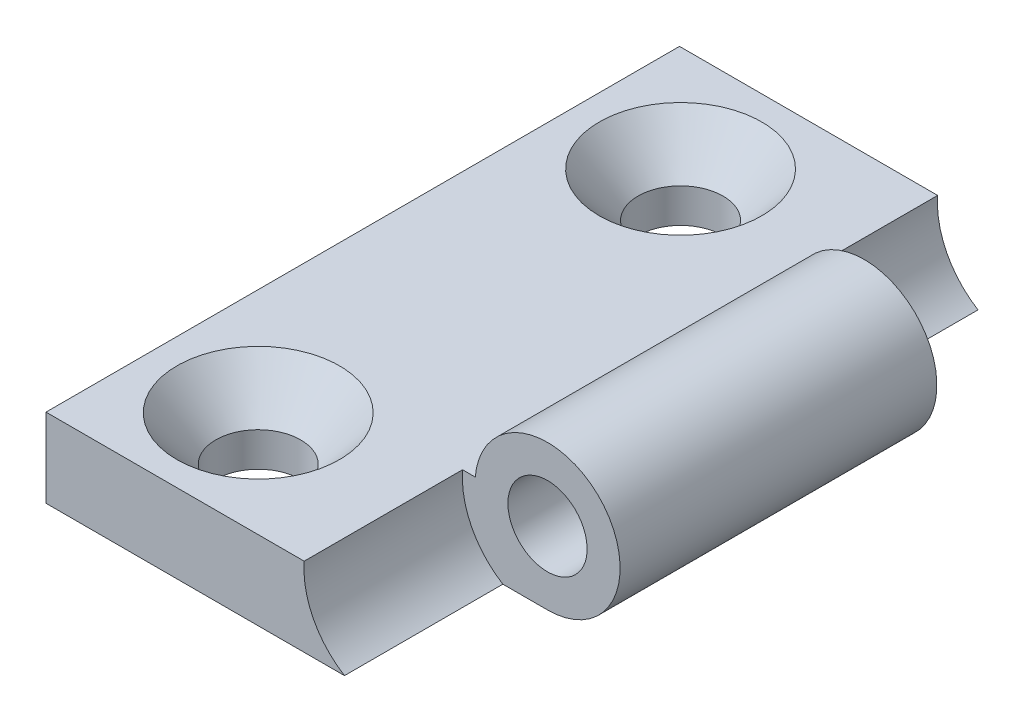
ISO-10303-21;
HEADER;
FILE_DESCRIPTION(('STEP AP214'),'2;1');
FILE_NAME('part.step','',(''),(''),'','','');
FILE_SCHEMA(('AUTOMOTIVE_DESIGN { 1 0 10303 214 1 1 1 1 }'));
ENDSEC;
DATA;
#1=APPLICATION_CONTEXT('core data for automotive mechanical design processes');
#2=APPLICATION_PROTOCOL_DEFINITION('international standard','automotive_design',2000,#1);
#3=PRODUCT_CONTEXT('',#1,'mechanical');
#4=PRODUCT('Part','Part','',(#3));
#5=PRODUCT_RELATED_PRODUCT_CATEGORY('part','',(#4));
#6=PRODUCT_DEFINITION_FORMATION('','',#4);
#7=PRODUCT_DEFINITION_CONTEXT('part definition',#1,'design');
#8=PRODUCT_DEFINITION('design','',#6,#7);
#9=PRODUCT_DEFINITION_SHAPE('','',#8);
#10=(LENGTH_UNIT() NAMED_UNIT(*) SI_UNIT(.MILLI.,.METRE.));
#11=(NAMED_UNIT(*) PLANE_ANGLE_UNIT() SI_UNIT($,.RADIAN.));
#12=(NAMED_UNIT(*) SI_UNIT($,.STERADIAN.) SOLID_ANGLE_UNIT());
#13=UNCERTAINTY_MEASURE_WITH_UNIT(LENGTH_MEASURE(1.E-05),#10,'distance_accuracy_value','');
#14=(GEOMETRIC_REPRESENTATION_CONTEXT(3) GLOBAL_UNCERTAINTY_ASSIGNED_CONTEXT((#13)) GLOBAL_UNIT_ASSIGNED_CONTEXT((#10,
#11,#12)) REPRESENTATION_CONTEXT('',''));
#15=CARTESIAN_POINT('',(0.,0.,0.));
#16=DIRECTION('',(0.,0.,1.));
#17=DIRECTION('',(1.,0.,0.));
#18=AXIS2_PLACEMENT_3D('',#15,#16,#17);
#19=CARTESIAN_POINT('',(0.,4.365625,19.05));
#20=DIRECTION('',(0.,0.,-1.));
#21=DIRECTION('',(-1.,0.,0.));
#22=AXIS2_PLACEMENT_3D('',#19,#20,#21);
#23=CYLINDRICAL_SURFACE('',#22,4.365625);
#24=CARTESIAN_POINT('',(0.,4.365625,-9.525));
#25=DIRECTION('',(0.,0.,-1.));
#26=DIRECTION('',(-1.,0.,0.));
#27=AXIS2_PLACEMENT_3D('',#24,#25,#26);
#28=CIRCLE('',#27,4.365625);
#29=CARTESIAN_POINT('',(-4.34868844710678,4.7498,-9.525));
#30=VERTEX_POINT('',#29);
#31=CARTESIAN_POINT('',(0.,0.,-9.525));
#32=VERTEX_POINT('',#31);
#33=EDGE_CURVE('E102',#30,#32,#28,.T.);
#34=ORIENTED_EDGE('',*,*,#33,.F.);
#35=DIRECTION('',(0.,0.,-1.));
#36=VECTOR('',#35,1.);
#37=CARTESIAN_POINT('',(-4.34868844710678,4.7498,19.05));
#38=LINE('',#37,#36);
#39=CARTESIAN_POINT('',(-4.34868844710678,4.7498,9.525));
#40=VERTEX_POINT('',#39);
#41=EDGE_CURVE('E112',#40,#30,#38,.T.);
#42=ORIENTED_EDGE('',*,*,#41,.F.);
#43=CARTESIAN_POINT('',(0.,4.365625,9.525));
#44=DIRECTION('',(0.,0.,1.));
#45=DIRECTION('',(1.,0.,0.));
#46=AXIS2_PLACEMENT_3D('',#43,#44,#45);
#47=CIRCLE('',#46,4.365625);
#48=CARTESIAN_POINT('',(0.,0.,9.525));
#49=VERTEX_POINT('',#48);
#50=EDGE_CURVE('E58',#49,#40,#47,.T.);
#51=ORIENTED_EDGE('',*,*,#50,.F.);
#52=DIRECTION('',(0.,0.,-1.));
#53=VECTOR('',#52,1.);
#54=CARTESIAN_POINT('',(0.,0.,19.05));
#55=LINE('',#54,#53);
#56=EDGE_CURVE('E43',#49,#32,#55,.T.);
#57=ORIENTED_EDGE('',*,*,#56,.T.);
#58=EDGE_LOOP('',(#34,#42,#51,#57));
#59=FACE_BOUND('',#58,.T.);
#60=ADVANCED_FACE('F34',(#59),#23,.T.);
#61=CARTESIAN_POINT('',(0.,4.365625,19.05));
#62=DIRECTION('',(0.,0.,-1.));
#63=DIRECTION('',(-1.,0.,0.));
#64=AXIS2_PLACEMENT_3D('',#61,#62,#63);
#65=CYLINDRICAL_SURFACE('',#64,2.38125);
#66=CARTESIAN_POINT('',(0.,4.365625,9.525));
#67=DIRECTION('',(0.,0.,1.));
#68=DIRECTION('',(1.,0.,0.));
#69=AXIS2_PLACEMENT_3D('',#66,#67,#68);
#70=CIRCLE('',#69,2.38125);
#71=CARTESIAN_POINT('',(-2.38125,4.365625,9.525));
#72=VERTEX_POINT('',#71);
#73=EDGE_CURVE('E38',#72,#72,#70,.T.);
#74=CARTESIAN_POINT('',(0.,4.365625,-9.525));
#75=DIRECTION('',(0.,0.,-1.));
#76=DIRECTION('',(-1.,0.,0.));
#77=AXIS2_PLACEMENT_3D('',#74,#75,#76);
#78=CIRCLE('',#77,2.38125);
#79=CARTESIAN_POINT('',(-2.38125,4.365625,-9.525));
#80=VERTEX_POINT('',#79);
#81=EDGE_CURVE('E115',#80,#80,#78,.T.);
#82=CARTESIAN_POINT('',(-2.38125,4.365625,9.525));
#83=CARTESIAN_POINT('',(-2.38125,4.365625,9.3265625));
#84=CARTESIAN_POINT('',(-2.38125,4.365625,9.128125));
#85=CARTESIAN_POINT('',(-2.38125,4.365625,8.73125));
#86=CARTESIAN_POINT('',(-2.38125,4.365625,8.5328125));
#87=CARTESIAN_POINT('',(-2.38125,4.365625,8.1359375));
#88=CARTESIAN_POINT('',(-2.38125,4.365625,7.9375));
#89=CARTESIAN_POINT('',(-2.38125,4.365625,7.540625));
#90=CARTESIAN_POINT('',(-2.38125,4.365625,7.3421875));
#91=CARTESIAN_POINT('',(-2.38125,4.365625,6.9453125));
#92=CARTESIAN_POINT('',(-2.38125,4.365625,6.746875));
#93=CARTESIAN_POINT('',(-2.38125,4.365625,6.35));
#94=CARTESIAN_POINT('',(-2.38125,4.365625,6.1515625));
#95=CARTESIAN_POINT('',(-2.38125,4.365625,5.7546875));
#96=CARTESIAN_POINT('',(-2.38125,4.365625,5.55625));
#97=CARTESIAN_POINT('',(-2.38125,4.365625,5.159375));
#98=CARTESIAN_POINT('',(-2.38125,4.365625,4.9609375));
#99=CARTESIAN_POINT('',(-2.38125,4.365625,4.5640625));
#100=CARTESIAN_POINT('',(-2.38125,4.365625,4.365625));
#101=CARTESIAN_POINT('',(-2.38125,4.365625,3.96875));
#102=CARTESIAN_POINT('',(-2.38125,4.365625,3.7703125));
#103=CARTESIAN_POINT('',(-2.38125,4.365625,3.3734375));
#104=CARTESIAN_POINT('',(-2.38125,4.365625,3.175));
#105=CARTESIAN_POINT('',(-2.38125,4.365625,2.778125));
#106=CARTESIAN_POINT('',(-2.38125,4.365625,2.5796875));
#107=CARTESIAN_POINT('',(-2.38125,4.365625,2.1828125));
#108=CARTESIAN_POINT('',(-2.38125,4.365625,1.984375));
#109=CARTESIAN_POINT('',(-2.38125,4.365625,1.5875));
#110=CARTESIAN_POINT('',(-2.38125,4.365625,1.3890625));
#111=CARTESIAN_POINT('',(-2.38125,4.365625,0.992187500000001));
#112=CARTESIAN_POINT('',(-2.38125,4.365625,0.793750000000001));
#113=CARTESIAN_POINT('',(-2.38125,4.365625,0.396875));
#114=CARTESIAN_POINT('',(-2.38125,4.365625,0.1984375));
#115=CARTESIAN_POINT('',(-2.38125,4.365625,-0.1984375));
#116=CARTESIAN_POINT('',(-2.38125,4.365625,-0.396875));
#117=CARTESIAN_POINT('',(-2.38125,4.365625,-0.793750000000001));
#118=CARTESIAN_POINT('',(-2.38125,4.365625,-0.992187500000001));
#119=CARTESIAN_POINT('',(-2.38125,4.365625,-1.3890625));
#120=CARTESIAN_POINT('',(-2.38125,4.365625,-1.5875));
#121=CARTESIAN_POINT('',(-2.38125,4.365625,-1.984375));
#122=CARTESIAN_POINT('',(-2.38125,4.365625,-2.1828125));
#123=CARTESIAN_POINT('',(-2.38125,4.365625,-2.5796875));
#124=CARTESIAN_POINT('',(-2.38125,4.365625,-2.778125));
#125=CARTESIAN_POINT('',(-2.38125,4.365625,-3.175));
#126=CARTESIAN_POINT('',(-2.38125,4.365625,-3.3734375));
#127=CARTESIAN_POINT('',(-2.38125,4.365625,-3.7703125));
#128=CARTESIAN_POINT('',(-2.38125,4.365625,-3.96875));
#129=CARTESIAN_POINT('',(-2.38125,4.365625,-4.365625));
#130=CARTESIAN_POINT('',(-2.38125,4.365625,-4.5640625));
#131=CARTESIAN_POINT('',(-2.38125,4.365625,-4.9609375));
#132=CARTESIAN_POINT('',(-2.38125,4.365625,-5.159375));
#133=CARTESIAN_POINT('',(-2.38125,4.365625,-5.55625));
#134=CARTESIAN_POINT('',(-2.38125,4.365625,-5.7546875));
#135=CARTESIAN_POINT('',(-2.38125,4.365625,-6.1515625));
#136=CARTESIAN_POINT('',(-2.38125,4.365625,-6.35));
#137=CARTESIAN_POINT('',(-2.38125,4.365625,-6.746875));
#138=CARTESIAN_POINT('',(-2.38125,4.365625,-6.9453125));
#139=CARTESIAN_POINT('',(-2.38125,4.365625,-7.3421875));
#140=CARTESIAN_POINT('',(-2.38125,4.365625,-7.540625));
#141=CARTESIAN_POINT('',(-2.38125,4.365625,-7.9375));
#142=CARTESIAN_POINT('',(-2.38125,4.365625,-8.1359375));
#143=CARTESIAN_POINT('',(-2.38125,4.365625,-8.5328125));
#144=CARTESIAN_POINT('',(-2.38125,4.365625,-8.73125));
#145=CARTESIAN_POINT('',(-2.38125,4.365625,-9.128125));
#146=CARTESIAN_POINT('',(-2.38125,4.365625,-9.3265625));
#147=CARTESIAN_POINT('',(-2.38125,4.365625,-9.525));
#148=B_SPLINE_CURVE_WITH_KNOTS('',3,(#82,#83,#84,#85,#86,#87,#88,#89,#90,#91,#92,#93,#94,#95,
#96,#97,#98,#99,#100,#101,#102,#103,#104,#105,#106,#107,#108,#109,#110,#111,#112,#113,#114,#115,
#116,#117,#118,#119,#120,#121,#122,#123,#124,#125,#126,#127,#128,#129,#130,#131,#132,#133,#134,
#135,#136,#137,#138,#139,#140,#141,#142,#143,#144,#145,#146,#147),.UNSPECIFIED.,.F.,.F.,(4,2,2,
2,2,2,2,2,2,2,2,2,2,2,2,2,2,2,2,2,2,2,2,2,2,2,2,2,2,2,2,2,4),(0.,0.5953125,1.190625,1.7859375,
2.38125,2.9765625,3.571875,4.1671875,4.7625,5.3578125,5.953125,6.5484375,7.14375,7.7390625,
8.334375,8.9296875,9.525,10.1203125,10.715625,11.3109375,11.90625,12.5015625,13.096875,
13.6921875,14.2875,14.8828125,15.478125,16.0734375,16.66875,17.2640625,17.859375,18.4546875,
19.05),.UNSPECIFIED.);
#149=EDGE_CURVE('BSEAM223',#72,#80,#148,.T.);
#150=ORIENTED_EDGE('',*,*,#73,.T.);
#151=ORIENTED_EDGE('',*,*,#81,.T.);
#152=ORIENTED_EDGE('',*,*,#149,.T.);
#153=ORIENTED_EDGE('',*,*,#149,.F.);
#154=EDGE_LOOP('',(#150,#152,#151,#153));
#155=FACE_BOUND('',#154,.T.);
#156=ADVANCED_FACE('F223',(#155),#65,.F.);
#157=CARTESIAN_POINT('',(0.,4.365625,-19.05));
#158=DIRECTION('',(0.,0.,1.));
#159=DIRECTION('',(1.,0.,0.));
#160=AXIS2_PLACEMENT_3D('',#157,#158,#159);
#161=PLANE('',#160);
#162=CARTESIAN_POINT('',(0.,4.365625,-19.05));
#163=DIRECTION('',(0.,0.,1.));
#164=DIRECTION('',(1.,0.,0.));
#165=AXIS2_PLACEMENT_3D('',#162,#163,#164);
#166=CIRCLE('',#165,5.1251074948742);
#167=CARTESIAN_POINT('',(-5.11068844710678,4.7498,-19.05));
#168=VERTEX_POINT('',#167);
#169=CARTESIAN_POINT('',(-2.68478028773133,0.,-19.05));
#170=VERTEX_POINT('',#169);
#171=EDGE_CURVE('E161',#168,#170,#166,.T.);
#172=ORIENTED_EDGE('',*,*,#171,.T.);
#173=DIRECTION('',(1.,0.,0.));
#174=VECTOR('',#173,1.);
#175=CARTESIAN_POINT('',(-20.6375,0.,-19.05));
#176=LINE('',#175,#174);
#177=CARTESIAN_POINT('',(-20.6375,0.,-19.05));
#178=VERTEX_POINT('',#177);
#179=EDGE_CURVE('E130',#178,#170,#176,.T.);
#180=ORIENTED_EDGE('',*,*,#179,.F.);
#181=DIRECTION('',(0.,-1.,0.));
#182=VECTOR('',#181,1.);
#183=CARTESIAN_POINT('',(-20.6375,0.,-19.05));
#184=LINE('',#183,#182);
#185=CARTESIAN_POINT('',(-20.6375,4.7498,-19.05));
#186=VERTEX_POINT('',#185);
#187=EDGE_CURVE('E133',#186,#178,#184,.T.);
#188=ORIENTED_EDGE('',*,*,#187,.F.);
#189=DIRECTION('',(-1.,0.,0.));
#190=VECTOR('',#189,1.);
#191=CARTESIAN_POINT('',(-20.6375,4.7498,-19.05));
#192=LINE('',#191,#190);
#193=EDGE_CURVE('E127',#168,#186,#192,.T.);
#194=ORIENTED_EDGE('',*,*,#193,.F.);
#195=EDGE_LOOP('',(#172,#180,#188,#194));
#196=FACE_BOUND('',#195,.T.);
#197=ADVANCED_FACE('F228',(#196),#161,.F.);
#198=CARTESIAN_POINT('',(-20.6375,0.,19.05));
#199=DIRECTION('',(0.,1.,0.));
#200=DIRECTION('',(0.,0.,1.));
#201=AXIS2_PLACEMENT_3D('',#198,#199,#200);
#202=PLANE('',#201);
#203=CARTESIAN_POINT('',(-14.224,0.,-12.7));
#204=DIRECTION('',(0.,1.,0.));
#205=DIRECTION('',(0.,0.,1.));
#206=AXIS2_PLACEMENT_3D('',#203,#204,#205);
#207=CIRCLE('',#206,2.5527);
#208=CARTESIAN_POINT('',(-14.224,0.,-10.1473));
#209=VERTEX_POINT('',#208);
#210=EDGE_CURVE('E181',#209,#209,#207,.T.);
#211=ORIENTED_EDGE('',*,*,#210,.T.);
#212=EDGE_LOOP('',(#211));
#213=FACE_BOUND('',#212,.T.);
#214=CARTESIAN_POINT('',(-14.224,0.,12.7));
#215=DIRECTION('',(0.,1.,0.));
#216=DIRECTION('',(0.,0.,1.));
#217=AXIS2_PLACEMENT_3D('',#214,#215,#216);
#218=CIRCLE('',#217,2.5527);
#219=CARTESIAN_POINT('',(-14.224,0.,15.2527));
#220=VERTEX_POINT('',#219);
#221=EDGE_CURVE('E172',#220,#220,#218,.T.);
#222=ORIENTED_EDGE('',*,*,#221,.T.);
#223=EDGE_LOOP('',(#222));
#224=FACE_BOUND('',#223,.T.);
#225=DIRECTION('',(0.,0.,-1.));
#226=VECTOR('',#225,1.);
#227=CARTESIAN_POINT('',(-2.68478028773133,0.,-9.525));
#228=LINE('',#227,#226);
#229=CARTESIAN_POINT('',(-2.68478028773133,0.,-9.525));
#230=VERTEX_POINT('',#229);
#231=EDGE_CURVE('E157',#230,#170,#228,.T.);
#232=ORIENTED_EDGE('',*,*,#231,.F.);
#233=DIRECTION('',(1.,0.,0.));
#234=VECTOR('',#233,1.);
#235=CARTESIAN_POINT('',(0.,0.,-9.525));
#236=LINE('',#235,#234);
#237=EDGE_CURVE('E107',#230,#32,#236,.T.);
#238=ORIENTED_EDGE('',*,*,#237,.T.);
#239=ORIENTED_EDGE('',*,*,#56,.F.);
#240=DIRECTION('',(1.,0.,0.));
#241=VECTOR('',#240,1.);
#242=CARTESIAN_POINT('',(0.,0.,9.525));
#243=LINE('',#242,#241);
#244=CARTESIAN_POINT('',(-2.68478028773133,0.,9.525));
#245=VERTEX_POINT('',#244);
#246=EDGE_CURVE('E151',#245,#49,#243,.T.);
#247=ORIENTED_EDGE('',*,*,#246,.F.);
#248=DIRECTION('',(0.,0.,1.));
#249=VECTOR('',#248,1.);
#250=CARTESIAN_POINT('',(-2.68478028773133,0.,9.525));
#251=LINE('',#250,#249);
#252=CARTESIAN_POINT('',(-2.68478028773133,0.,19.05));
#253=VERTEX_POINT('',#252);
#254=EDGE_CURVE('E143',#245,#253,#251,.T.);
#255=ORIENTED_EDGE('',*,*,#254,.T.);
#256=DIRECTION('',(1.,0.,0.));
#257=VECTOR('',#256,1.);
#258=CARTESIAN_POINT('',(-20.6375,0.,19.05));
#259=LINE('',#258,#257);
#260=CARTESIAN_POINT('',(-20.6375,0.,19.05));
#261=VERTEX_POINT('',#260);
#262=EDGE_CURVE('E137',#261,#253,#259,.T.);
#263=ORIENTED_EDGE('',*,*,#262,.F.);
#264=DIRECTION('',(0.,0.,-1.));
#265=VECTOR('',#264,1.);
#266=CARTESIAN_POINT('',(-20.6375,0.,19.05));
#267=LINE('',#266,#265);
#268=EDGE_CURVE('E11',#261,#178,#267,.T.);
#269=ORIENTED_EDGE('',*,*,#268,.T.);
#270=ORIENTED_EDGE('',*,*,#179,.T.);
#271=EDGE_LOOP('',(#232,#238,#239,#247,#255,#263,#269,#270));
#272=FACE_BOUND('',#271,.T.);
#273=ADVANCED_FACE('F185',(#213,#224,#272),#202,.F.);
#274=CARTESIAN_POINT('',(-20.6375,4.7498,19.05));
#275=DIRECTION('',(0.,-1.,0.));
#276=DIRECTION('',(0.,0.,-1.));
#277=AXIS2_PLACEMENT_3D('',#274,#275,#276);
#278=PLANE('',#277);
#279=CARTESIAN_POINT('',(-14.224,4.7498,-12.7));
#280=DIRECTION('',(0.,1.,0.));
#281=DIRECTION('',(0.,0.,1.));
#282=AXIS2_PLACEMENT_3D('',#279,#280,#281);
#283=CIRCLE('',#282,4.8895);
#284=CARTESIAN_POINT('',(-14.224,4.7498,-7.81049999999999));
#285=VERTEX_POINT('',#284);
#286=EDGE_CURVE('E175',#285,#285,#283,.T.);
#287=ORIENTED_EDGE('',*,*,#286,.F.);
#288=EDGE_LOOP('',(#287));
#289=FACE_BOUND('',#288,.T.);
#290=CARTESIAN_POINT('',(-14.224,4.7498,12.7));
#291=DIRECTION('',(0.,1.,0.));
#292=DIRECTION('',(0.,0.,1.));
#293=AXIS2_PLACEMENT_3D('',#290,#291,#292);
#294=CIRCLE('',#293,4.8895);
#295=CARTESIAN_POINT('',(-14.224,4.7498,17.5895));
#296=VERTEX_POINT('',#295);
#297=EDGE_CURVE('E164',#296,#296,#294,.T.);
#298=ORIENTED_EDGE('',*,*,#297,.F.);
#299=EDGE_LOOP('',(#298));
#300=FACE_BOUND('',#299,.T.);
#301=DIRECTION('',(0.,0.,-1.));
#302=VECTOR('',#301,1.);
#303=CARTESIAN_POINT('',(-5.11068844710678,4.7498,-9.525));
#304=LINE('',#303,#302);
#305=CARTESIAN_POINT('',(-5.11068844710678,4.7498,-9.525));
#306=VERTEX_POINT('',#305);
#307=EDGE_CURVE('E158',#306,#168,#304,.T.);
#308=ORIENTED_EDGE('',*,*,#307,.T.);
#309=ORIENTED_EDGE('',*,*,#193,.T.);
#310=DIRECTION('',(0.,0.,-1.));
#311=VECTOR('',#310,1.);
#312=CARTESIAN_POINT('',(-20.6375,4.7498,19.05));
#313=LINE('',#312,#311);
#314=CARTESIAN_POINT('',(-20.6375,4.7498,19.05));
#315=VERTEX_POINT('',#314);
#316=EDGE_CURVE('E120',#315,#186,#313,.T.);
#317=ORIENTED_EDGE('',*,*,#316,.F.);
#318=DIRECTION('',(-1.,0.,0.));
#319=VECTOR('',#318,1.);
#320=CARTESIAN_POINT('',(-20.6375,4.7498,19.05));
#321=LINE('',#320,#319);
#322=CARTESIAN_POINT('',(-5.11068844710678,4.7498,19.05));
#323=VERTEX_POINT('',#322);
#324=EDGE_CURVE('E124',#323,#315,#321,.T.);
#325=ORIENTED_EDGE('',*,*,#324,.F.);
#326=DIRECTION('',(0.,0.,1.));
#327=VECTOR('',#326,1.);
#328=CARTESIAN_POINT('',(-5.11068844710678,4.7498,9.525));
#329=LINE('',#328,#327);
#330=CARTESIAN_POINT('',(-5.11068844710678,4.7498,9.525));
#331=VERTEX_POINT('',#330);
#332=EDGE_CURVE('E146',#331,#323,#329,.T.);
#333=ORIENTED_EDGE('',*,*,#332,.F.);
#334=DIRECTION('',(-1.,0.,0.));
#335=VECTOR('',#334,1.);
#336=CARTESIAN_POINT('',(-5.11068844710678,4.7498,9.525));
#337=LINE('',#336,#335);
#338=EDGE_CURVE('E119',#40,#331,#337,.T.);
#339=ORIENTED_EDGE('',*,*,#338,.F.);
#340=ORIENTED_EDGE('',*,*,#41,.T.);
#341=DIRECTION('',(-1.,0.,0.));
#342=VECTOR('',#341,1.);
#343=CARTESIAN_POINT('',(-5.11068844710678,4.7498,-9.525));
#344=LINE('',#343,#342);
#345=EDGE_CURVE('E99',#30,#306,#344,.T.);
#346=ORIENTED_EDGE('',*,*,#345,.T.);
#347=EDGE_LOOP('',(#308,#309,#317,#325,#333,#339,#340,#346));
#348=FACE_BOUND('',#347,.T.);
#349=ADVANCED_FACE('F117',(#289,#300,#348),#278,.F.);
#350=CARTESIAN_POINT('',(0.,4.365625,19.05));
#351=DIRECTION('',(0.,0.,1.));
#352=DIRECTION('',(1.,0.,0.));
#353=AXIS2_PLACEMENT_3D('',#350,#351,#352);
#354=PLANE('',#353);
#355=CARTESIAN_POINT('',(0.,4.365625,19.05));
#356=DIRECTION('',(0.,0.,1.));
#357=DIRECTION('',(1.,0.,0.));
#358=AXIS2_PLACEMENT_3D('',#355,#356,#357);
#359=CIRCLE('',#358,5.1251074948742);
#360=EDGE_CURVE('E114',#323,#253,#359,.T.);
#361=ORIENTED_EDGE('',*,*,#360,.F.);
#362=ORIENTED_EDGE('',*,*,#324,.T.);
#363=DIRECTION('',(0.,-1.,0.));
#364=VECTOR('',#363,1.);
#365=CARTESIAN_POINT('',(-20.6375,0.,19.05));
#366=LINE('',#365,#364);
#367=EDGE_CURVE('E129',#315,#261,#366,.T.);
#368=ORIENTED_EDGE('',*,*,#367,.T.);
#369=ORIENTED_EDGE('',*,*,#262,.T.);
#370=EDGE_LOOP('',(#361,#362,#368,#369));
#371=FACE_BOUND('',#370,.T.);
#372=ADVANCED_FACE('F203',(#371),#354,.T.);
#373=CARTESIAN_POINT('',(-20.6375,0.,19.05));
#374=DIRECTION('',(1.,0.,0.));
#375=DIRECTION('',(0.,0.,-1.));
#376=AXIS2_PLACEMENT_3D('',#373,#374,#375);
#377=PLANE('',#376);
#378=ORIENTED_EDGE('',*,*,#187,.T.);
#379=ORIENTED_EDGE('',*,*,#268,.F.);
#380=ORIENTED_EDGE('',*,*,#367,.F.);
#381=ORIENTED_EDGE('',*,*,#316,.T.);
#382=EDGE_LOOP('',(#378,#379,#380,#381));
#383=FACE_BOUND('',#382,.T.);
#384=ADVANCED_FACE('F36',(#383),#377,.F.);
#385=CARTESIAN_POINT('',(0.,4.365625,9.525));
#386=DIRECTION('',(0.,0.,1.));
#387=DIRECTION('',(1.,0.,0.));
#388=AXIS2_PLACEMENT_3D('',#385,#386,#387);
#389=PLANE('',#388);
#390=ORIENTED_EDGE('',*,*,#73,.F.);
#391=EDGE_LOOP('',(#390));
#392=FACE_BOUND('',#391,.T.);
#393=ORIENTED_EDGE('',*,*,#50,.T.);
#394=ORIENTED_EDGE('',*,*,#338,.T.);
#395=CARTESIAN_POINT('',(0.,4.365625,9.525));
#396=DIRECTION('',(0.,0.,1.));
#397=DIRECTION('',(1.,0.,0.));
#398=AXIS2_PLACEMENT_3D('',#395,#396,#397);
#399=CIRCLE('',#398,5.1251074948742);
#400=EDGE_CURVE('E149',#331,#245,#399,.T.);
#401=ORIENTED_EDGE('',*,*,#400,.T.);
#402=ORIENTED_EDGE('',*,*,#246,.T.);
#403=EDGE_LOOP('',(#393,#394,#401,#402));
#404=FACE_BOUND('',#403,.T.);
#405=ADVANCED_FACE('F246',(#392,#404),#389,.T.);
#406=CARTESIAN_POINT('',(0.,4.365625,9.525));
#407=DIRECTION('',(0.,0.,1.));
#408=DIRECTION('',(1.,0.,0.));
#409=AXIS2_PLACEMENT_3D('',#406,#407,#408);
#410=CYLINDRICAL_SURFACE('',#409,5.1251074948742);
#411=ORIENTED_EDGE('',*,*,#360,.T.);
#412=ORIENTED_EDGE('',*,*,#254,.F.);
#413=ORIENTED_EDGE('',*,*,#400,.F.);
#414=ORIENTED_EDGE('',*,*,#332,.T.);
#415=EDGE_LOOP('',(#411,#412,#413,#414));
#416=FACE_BOUND('',#415,.T.);
#417=ADVANCED_FACE('F243',(#416),#410,.F.);
#418=CARTESIAN_POINT('',(0.,4.365625,-9.525));
#419=DIRECTION('',(0.,0.,-1.));
#420=DIRECTION('',(1.,0.,0.));
#421=AXIS2_PLACEMENT_3D('',#418,#419,#420);
#422=PLANE('',#421);
#423=ORIENTED_EDGE('',*,*,#81,.F.);
#424=EDGE_LOOP('',(#423));
#425=FACE_BOUND('',#424,.T.);
#426=ORIENTED_EDGE('',*,*,#33,.T.);
#427=ORIENTED_EDGE('',*,*,#237,.F.);
#428=CARTESIAN_POINT('',(0.,4.365625,-9.525));
#429=DIRECTION('',(0.,0.,1.));
#430=DIRECTION('',(1.,0.,0.));
#431=AXIS2_PLACEMENT_3D('',#428,#429,#430);
#432=CIRCLE('',#431,5.1251074948742);
#433=EDGE_CURVE('E50',#306,#230,#432,.T.);
#434=ORIENTED_EDGE('',*,*,#433,.F.);
#435=ORIENTED_EDGE('',*,*,#345,.F.);
#436=EDGE_LOOP('',(#426,#427,#434,#435));
#437=FACE_BOUND('',#436,.T.);
#438=ADVANCED_FACE('F101',(#425,#437),#422,.T.);
#439=CARTESIAN_POINT('',(0.,4.365625,-9.525));
#440=DIRECTION('',(0.,0.,-1.));
#441=DIRECTION('',(-1.,0.,0.));
#442=AXIS2_PLACEMENT_3D('',#439,#440,#441);
#443=CYLINDRICAL_SURFACE('',#442,5.1251074948742);
#444=ORIENTED_EDGE('',*,*,#171,.F.);
#445=ORIENTED_EDGE('',*,*,#307,.F.);
#446=ORIENTED_EDGE('',*,*,#433,.T.);
#447=ORIENTED_EDGE('',*,*,#231,.T.);
#448=EDGE_LOOP('',(#444,#445,#446,#447));
#449=FACE_BOUND('',#448,.T.);
#450=ADVANCED_FACE('F209',(#449),#443,.F.);
#451=CARTESIAN_POINT('',(-14.224,4.7498,12.7));
#452=DIRECTION('',(0.,1.,0.));
#453=DIRECTION('',(0.,0.,1.));
#454=AXIS2_PLACEMENT_3D('',#451,#452,#453);
#455=CONICAL_SURFACE('',#454,4.8895,0.715584993317675);
#456=CARTESIAN_POINT('',(-14.224,2.06161910600595,12.7));
#457=DIRECTION('',(0.,1.,0.));
#458=DIRECTION('',(0.,0.,1.));
#459=AXIS2_PLACEMENT_3D('',#456,#457,#458);
#460=CIRCLE('',#459,2.5527);
#461=CARTESIAN_POINT('',(-14.224,2.06161910600595,15.2527));
#462=VERTEX_POINT('',#461);
#463=EDGE_CURVE('E169',#462,#462,#460,.T.);
#464=ORIENTED_EDGE('',*,*,#463,.F.);
#465=EDGE_LOOP('',(#464));
#466=FACE_BOUND('',#465,.T.);
#467=ORIENTED_EDGE('',*,*,#297,.T.);
#468=EDGE_LOOP('',(#467));
#469=FACE_BOUND('',#468,.T.);
#470=ADVANCED_FACE('F207',(#466,#469),#455,.F.);
#471=CARTESIAN_POINT('',(-14.224,4.7498,12.7));
#472=DIRECTION('',(0.,1.,0.));
#473=DIRECTION('',(0.,0.,1.));
#474=AXIS2_PLACEMENT_3D('',#471,#472,#473);
#475=CYLINDRICAL_SURFACE('',#474,2.5527);
#476=ORIENTED_EDGE('',*,*,#221,.F.);
#477=EDGE_LOOP('',(#476));
#478=FACE_BOUND('',#477,.T.);
#479=ORIENTED_EDGE('',*,*,#463,.T.);
#480=EDGE_LOOP('',(#479));
#481=FACE_BOUND('',#480,.T.);
#482=ADVANCED_FACE('F197',(#478,#481),#475,.F.);
#483=CARTESIAN_POINT('',(-14.224,4.7498,-12.7));
#484=DIRECTION('',(0.,1.,0.));
#485=DIRECTION('',(0.,0.,1.));
#486=AXIS2_PLACEMENT_3D('',#483,#484,#485);
#487=CONICAL_SURFACE('',#486,4.8895,0.715584993317675);
#488=CARTESIAN_POINT('',(-14.224,2.06161910600595,-12.7));
#489=DIRECTION('',(0.,1.,0.));
#490=DIRECTION('',(0.,0.,1.));
#491=AXIS2_PLACEMENT_3D('',#488,#489,#490);
#492=CIRCLE('',#491,2.5527);
#493=CARTESIAN_POINT('',(-14.224,2.06161910600595,-10.1473));
#494=VERTEX_POINT('',#493);
#495=EDGE_CURVE('E178',#494,#494,#492,.T.);
#496=ORIENTED_EDGE('',*,*,#495,.F.);
#497=EDGE_LOOP('',(#496));
#498=FACE_BOUND('',#497,.T.);
#499=ORIENTED_EDGE('',*,*,#286,.T.);
#500=EDGE_LOOP('',(#499));
#501=FACE_BOUND('',#500,.T.);
#502=ADVANCED_FACE('F191',(#498,#501),#487,.F.);
#503=CARTESIAN_POINT('',(-14.224,4.7498,-12.7));
#504=DIRECTION('',(0.,1.,0.));
#505=DIRECTION('',(0.,0.,1.));
#506=AXIS2_PLACEMENT_3D('',#503,#504,#505);
#507=CYLINDRICAL_SURFACE('',#506,2.5527);
#508=ORIENTED_EDGE('',*,*,#210,.F.);
#509=EDGE_LOOP('',(#508));
#510=FACE_BOUND('',#509,.T.);
#511=ORIENTED_EDGE('',*,*,#495,.T.);
#512=EDGE_LOOP('',(#511));
#513=FACE_BOUND('',#512,.T.);
#514=ADVANCED_FACE('F188',(#510,#513),#507,.F.);
#515=CLOSED_SHELL('',(#60,#156,#197,#273,#349,#372,#384,#405,#417,#438,#450,#470,#482,#502,#514));
#516=MANIFOLD_SOLID_BREP('B2',#515);
#517=ADVANCED_BREP_SHAPE_REPRESENTATION('',(#18,#516),#14);
#518=SHAPE_DEFINITION_REPRESENTATION(#9,#517);
ENDSEC;
END-ISO-10303-21;
